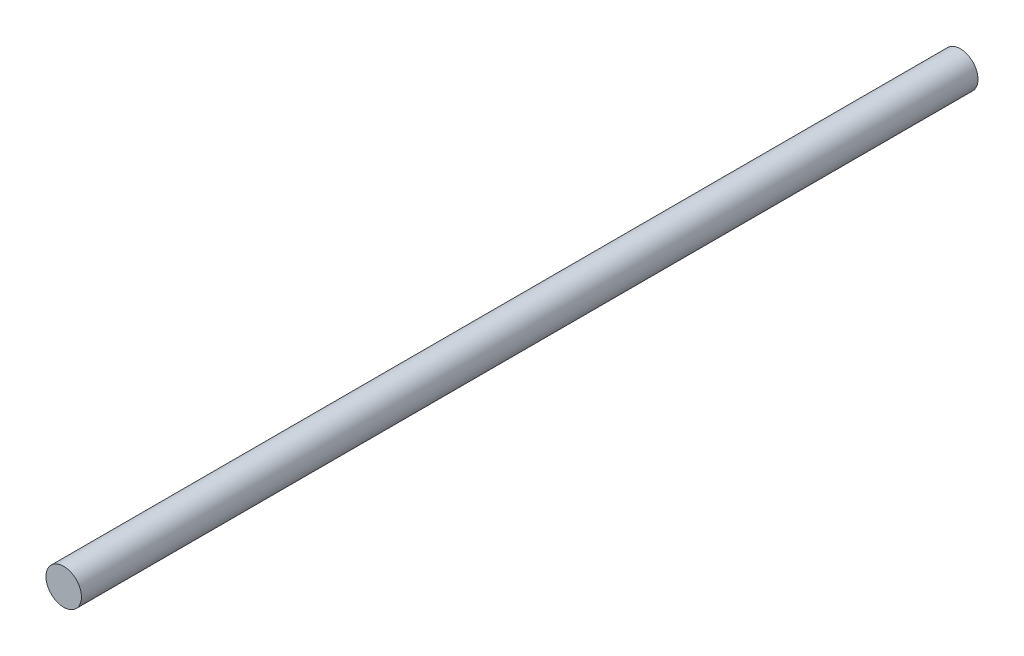
ISO-10303-21;
HEADER;
FILE_DESCRIPTION(('STEP AP214'),'2;1');
FILE_NAME('part.step','',(''),(''),'','','');
FILE_SCHEMA(('AUTOMOTIVE_DESIGN { 1 0 10303 214 1 1 1 1 }'));
ENDSEC;
DATA;
#1=APPLICATION_CONTEXT('core data for automotive mechanical design processes');
#2=APPLICATION_PROTOCOL_DEFINITION('international standard','automotive_design',2000,#1);
#3=PRODUCT_CONTEXT('',#1,'mechanical');
#4=PRODUCT('Part','Part','',(#3));
#5=PRODUCT_RELATED_PRODUCT_CATEGORY('part','',(#4));
#6=PRODUCT_DEFINITION_FORMATION('','',#4);
#7=PRODUCT_DEFINITION_CONTEXT('part definition',#1,'design');
#8=PRODUCT_DEFINITION('design','',#6,#7);
#9=PRODUCT_DEFINITION_SHAPE('','',#8);
#10=(LENGTH_UNIT() NAMED_UNIT(*) SI_UNIT(.MILLI.,.METRE.));
#11=(NAMED_UNIT(*) PLANE_ANGLE_UNIT() SI_UNIT($,.RADIAN.));
#12=(NAMED_UNIT(*) SI_UNIT($,.STERADIAN.) SOLID_ANGLE_UNIT());
#13=UNCERTAINTY_MEASURE_WITH_UNIT(LENGTH_MEASURE(1.E-05),#10,'distance_accuracy_value','');
#14=(GEOMETRIC_REPRESENTATION_CONTEXT(3) GLOBAL_UNCERTAINTY_ASSIGNED_CONTEXT((#13)) GLOBAL_UNIT_ASSIGNED_CONTEXT((#10,
#11,#12)) REPRESENTATION_CONTEXT('',''));
#15=CARTESIAN_POINT('',(0.,0.,0.));
#16=DIRECTION('',(0.,0.,1.));
#17=DIRECTION('',(1.,0.,0.));
#18=AXIS2_PLACEMENT_3D('',#15,#16,#17);
#19=CARTESIAN_POINT('',(92.9,-86.9,204.05));
#20=DIRECTION('',(0.,0.,1.));
#21=DIRECTION('',(1.,0.,0.));
#22=AXIS2_PLACEMENT_3D('',#19,#20,#21);
#23=PLANE('',#22);
#24=CARTESIAN_POINT('',(92.9,-86.9,204.05));
#25=DIRECTION('',(0.,0.,1.));
#26=DIRECTION('',(1.,0.,0.));
#27=AXIS2_PLACEMENT_3D('',#24,#25,#26);
#28=CIRCLE('',#27,1.5);
#29=CARTESIAN_POINT('',(94.4,-86.9,204.05));
#30=VERTEX_POINT('',#29);
#31=EDGE_CURVE('E18',#30,#30,#28,.F.);
#32=ORIENTED_EDGE('',*,*,#31,.F.);
#33=EDGE_LOOP('',(#32));
#34=FACE_BOUND('',#33,.T.);
#35=ADVANCED_FACE('F15',(#34),#23,.T.);
#36=CARTESIAN_POINT('',(92.9,-86.9,128.25));
#37=DIRECTION('',(0.,0.,1.));
#38=DIRECTION('',(1.,0.,0.));
#39=AXIS2_PLACEMENT_3D('',#36,#37,#38);
#40=PLANE('',#39);
#41=CARTESIAN_POINT('',(92.9,-86.9,128.25));
#42=DIRECTION('',(0.,0.,1.));
#43=DIRECTION('',(1.,0.,0.));
#44=AXIS2_PLACEMENT_3D('',#41,#42,#43);
#45=CIRCLE('',#44,1.5);
#46=CARTESIAN_POINT('',(94.4,-86.9,128.25));
#47=VERTEX_POINT('',#46);
#48=EDGE_CURVE('E10',#47,#47,#45,.T.);
#49=ORIENTED_EDGE('',*,*,#48,.F.);
#50=EDGE_LOOP('',(#49));
#51=FACE_BOUND('',#50,.T.);
#52=ADVANCED_FACE('F30',(#51),#40,.F.);
#53=CARTESIAN_POINT('',(92.9,-86.9,126.734));
#54=DIRECTION('',(0.,0.,1.));
#55=DIRECTION('',(1.,0.,0.));
#56=AXIS2_PLACEMENT_3D('',#53,#54,#55);
#57=CYLINDRICAL_SURFACE('',#56,1.5);
#58=ORIENTED_EDGE('',*,*,#31,.T.);
#59=EDGE_LOOP('',(#58));
#60=FACE_BOUND('',#59,.T.);
#61=ORIENTED_EDGE('',*,*,#48,.T.);
#62=EDGE_LOOP('',(#61));
#63=FACE_BOUND('',#62,.T.);
#64=ADVANCED_FACE('F27',(#60,#63),#57,.T.);
#65=CLOSED_SHELL('',(#35,#52,#64));
#66=MANIFOLD_SOLID_BREP('B1',#65);
#67=ADVANCED_BREP_SHAPE_REPRESENTATION('',(#18,#66),#14);
#68=SHAPE_DEFINITION_REPRESENTATION(#9,#67);
ENDSEC;
END-ISO-10303-21;
